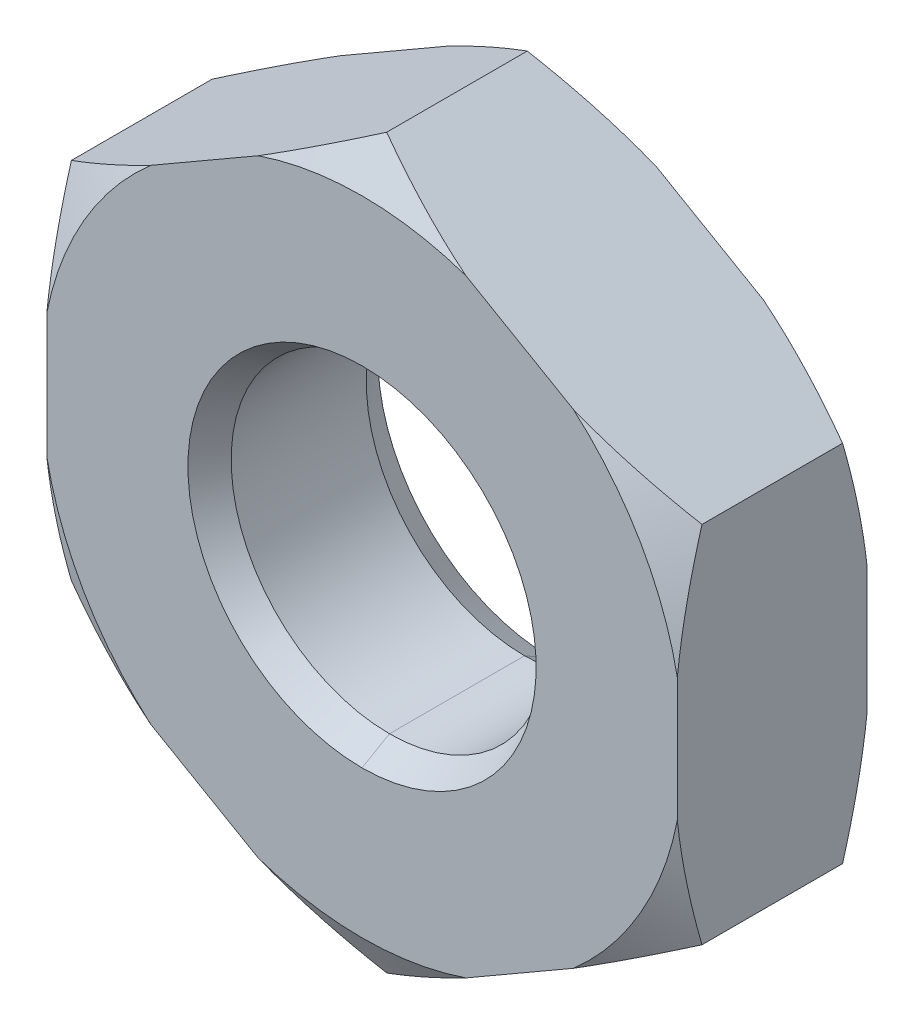
ISO-10303-21;
HEADER;
FILE_DESCRIPTION(('STEP AP214'),'2;1');
FILE_NAME('part.step','',(''),(''),'','','');
FILE_SCHEMA(('AUTOMOTIVE_DESIGN { 1 0 10303 214 1 1 1 1 }'));
ENDSEC;
DATA;
#1=APPLICATION_CONTEXT('core data for automotive mechanical design processes');
#2=APPLICATION_PROTOCOL_DEFINITION('international standard','automotive_design',2000,#1);
#3=PRODUCT_CONTEXT('',#1,'mechanical');
#4=PRODUCT('Part','Part','',(#3));
#5=PRODUCT_RELATED_PRODUCT_CATEGORY('part','',(#4));
#6=PRODUCT_DEFINITION_FORMATION('','',#4);
#7=PRODUCT_DEFINITION_CONTEXT('part definition',#1,'design');
#8=PRODUCT_DEFINITION('design','',#6,#7);
#9=PRODUCT_DEFINITION_SHAPE('','',#8);
#10=(LENGTH_UNIT() NAMED_UNIT(*) SI_UNIT(.MILLI.,.METRE.));
#11=(NAMED_UNIT(*) PLANE_ANGLE_UNIT() SI_UNIT($,.RADIAN.));
#12=(NAMED_UNIT(*) SI_UNIT($,.STERADIAN.) SOLID_ANGLE_UNIT());
#13=UNCERTAINTY_MEASURE_WITH_UNIT(LENGTH_MEASURE(1.E-05),#10,'distance_accuracy_value','');
#14=(GEOMETRIC_REPRESENTATION_CONTEXT(3) GLOBAL_UNCERTAINTY_ASSIGNED_CONTEXT((#13)) GLOBAL_UNIT_ASSIGNED_CONTEXT((#10,
#11,#12)) REPRESENTATION_CONTEXT('',''));
#15=CARTESIAN_POINT('',(0.,0.,0.));
#16=DIRECTION('',(0.,0.,1.));
#17=DIRECTION('',(1.,0.,0.));
#18=AXIS2_PLACEMENT_3D('',#15,#16,#17);
#19=CARTESIAN_POINT('',(0.,0.,-0.6));
#20=DIRECTION('',(0.,0.,1.));
#21=DIRECTION('',(0.479425538604204,-0.877582561890372,0.));
#22=AXIS2_PLACEMENT_3D('',#19,#20,#21);
#23=CONICAL_SURFACE('',#22,2.03001594543,1.0471975512);
#24=CARTESIAN_POINT('',(0.,0.,-0.6));
#25=DIRECTION('',(0.,0.,1.));
#26=DIRECTION('',(1.,0.,0.));
#27=AXIS2_PLACEMENT_3D('',#24,#25,#26);
#28=CIRCLE('',#27,2.03001594543);
#29=CARTESIAN_POINT('',(1.9918584287,0.391745757754,-0.6));
#30=VERTEX_POINT('',#29);
#31=CARTESIAN_POINT('',(1.33519099239,1.52912712112,-0.6));
#32=VERTEX_POINT('',#31);
#33=EDGE_CURVE('E322',#30,#32,#28,.T.);
#34=ORIENTED_EDGE('',*,*,#33,.T.);
#35=CARTESIAN_POINT('',(1.33519099239,1.52912712112,-0.6));
#36=CARTESIAN_POINT('',(1.46523461842,1.45404639863,-0.583269740997));
#37=CARTESIAN_POINT('',(1.59590801461,1.37860207816,-0.558740826829));
#38=CARTESIAN_POINT('',(1.72727925571,1.30275485675,-0.526817697776));
#39=CARTESIAN_POINT('',(1.85946427917,1.22643779787,-0.488256016597));
#40=CARTESIAN_POINT('',(1.9918584287,1.15,-0.44412463342));
#41=(BOUNDED_CURVE() B_SPLINE_CURVE(5,(#35,#36,#37,#38,#39,#40),.UNSPECIFIED.,.F.,
.F.) B_SPLINE_CURVE_WITH_KNOTS((6,6),(0.,1.10272272352),
.UNSPECIFIED.) CURVE() GEOMETRIC_REPRESENTATION_ITEM() RATIONAL_B_SPLINE_CURVE((1.,1.,1.,1.,1.,1.)) REPRESENTATION_ITEM(''));
#42=CARTESIAN_POINT('',(1.9918584287,1.15,-0.44412463342));
#43=VERTEX_POINT('',#42);
#44=EDGE_CURVE('E252',#32,#43,#41,.T.);
#45=ORIENTED_EDGE('',*,*,#44,.T.);
#46=CARTESIAN_POINT('',(1.9918584287,0.391745757754,-0.6));
#47=CARTESIAN_POINT('',(1.9918584287,0.541907202742,-0.583269740997));
#48=CARTESIAN_POINT('',(1.9918584287,0.692795843675,-0.558740826829));
#49=CARTESIAN_POINT('',(1.9918584287,0.8444902865,-0.526817697775));
#50=CARTESIAN_POINT('',(1.9918584287,0.997124404259,-0.488256016596));
#51=CARTESIAN_POINT('',(1.9918584287,1.15,-0.44412463342));
#52=(BOUNDED_CURVE() B_SPLINE_CURVE(5,(#46,#47,#48,#49,#50,#51),.UNSPECIFIED.,.F.,
.F.) B_SPLINE_CURVE_WITH_KNOTS((6,6),(0.,1.1027227235),
.UNSPECIFIED.) CURVE() GEOMETRIC_REPRESENTATION_ITEM() RATIONAL_B_SPLINE_CURVE((1.,1.,1.,1.,1.,1.)) REPRESENTATION_ITEM(''));
#53=EDGE_CURVE('E211',#30,#43,#52,.T.);
#54=ORIENTED_EDGE('',*,*,#53,.F.);
#55=EDGE_LOOP('',(#34,#45,#54));
#56=FACE_BOUND('',#55,.T.);
#57=ADVANCED_FACE('F17',(#56),#23,.T.);
#58=CARTESIAN_POINT('',(0.,0.,0.6));
#59=DIRECTION('',(0.,0.,-1.));
#60=DIRECTION('',(0.479425538604204,-0.877582561890372,0.));
#61=AXIS2_PLACEMENT_3D('',#58,#59,#60);
#62=CONICAL_SURFACE('',#61,2.03001594543,1.0471975512);
#63=CARTESIAN_POINT('',(1.33519099239,1.52912712112,0.6));
#64=CARTESIAN_POINT('',(1.46523461842,1.45404639863,0.583269740997));
#65=CARTESIAN_POINT('',(1.59590801461,1.37860207816,0.558740826829));
#66=CARTESIAN_POINT('',(1.72727925571,1.30275485675,0.526817697775));
#67=CARTESIAN_POINT('',(1.85946427917,1.22643779787,0.488256016597));
#68=CARTESIAN_POINT('',(1.9918584287,1.15,0.44412463342));
#69=(BOUNDED_CURVE() B_SPLINE_CURVE(5,(#63,#64,#65,#66,#67,#68),.UNSPECIFIED.,.F.,
.F.) B_SPLINE_CURVE_WITH_KNOTS((6,6),(0.,1.10272272351),
.UNSPECIFIED.) CURVE() GEOMETRIC_REPRESENTATION_ITEM() RATIONAL_B_SPLINE_CURVE((1.,1.,1.,1.,1.,1.)) REPRESENTATION_ITEM(''));
#70=CARTESIAN_POINT('',(1.33519099239,1.52912712112,0.6));
#71=VERTEX_POINT('',#70);
#72=CARTESIAN_POINT('',(1.9918584287,1.15,0.44412463342));
#73=VERTEX_POINT('',#72);
#74=EDGE_CURVE('E199',#71,#73,#69,.T.);
#75=ORIENTED_EDGE('',*,*,#74,.F.);
#76=CARTESIAN_POINT('',(0.,0.,0.6));
#77=DIRECTION('',(0.,0.,1.));
#78=DIRECTION('',(1.,0.,0.));
#79=AXIS2_PLACEMENT_3D('',#76,#77,#78);
#80=CIRCLE('',#79,2.03001594543);
#81=CARTESIAN_POINT('',(1.9918584287,0.391745757754,0.6));
#82=VERTEX_POINT('',#81);
#83=EDGE_CURVE('E171',#82,#71,#80,.T.);
#84=ORIENTED_EDGE('',*,*,#83,.F.);
#85=CARTESIAN_POINT('',(1.9918584287,0.391745757754,0.6));
#86=CARTESIAN_POINT('',(1.9918584287,0.541907202743,0.583269740997));
#87=CARTESIAN_POINT('',(1.9918584287,0.692795843676,0.558740826829));
#88=CARTESIAN_POINT('',(1.9918584287,0.844490286499,0.526817697775));
#89=CARTESIAN_POINT('',(1.9918584287,0.997124404259,0.488256016597));
#90=CARTESIAN_POINT('',(1.9918584287,1.15,0.44412463342));
#91=(BOUNDED_CURVE() B_SPLINE_CURVE(5,(#85,#86,#87,#88,#89,#90),.UNSPECIFIED.,.F.,
.F.) B_SPLINE_CURVE_WITH_KNOTS((6,6),(0.,1.10272272351),
.UNSPECIFIED.) CURVE() GEOMETRIC_REPRESENTATION_ITEM() RATIONAL_B_SPLINE_CURVE((1.,1.,1.,1.,1.,1.)) REPRESENTATION_ITEM(''));
#92=EDGE_CURVE('E160',#82,#73,#91,.T.);
#93=ORIENTED_EDGE('',*,*,#92,.T.);
#94=EDGE_LOOP('',(#75,#84,#93));
#95=FACE_BOUND('',#94,.T.);
#96=ADVANCED_FACE('F643',(#95),#62,.T.);
#97=CARTESIAN_POINT('',(0.,0.,0.6));
#98=DIRECTION('',(0.,0.,-1.));
#99=DIRECTION('',(0.479425538604204,-0.877582561890372,0.));
#100=AXIS2_PLACEMENT_3D('',#97,#98,#99);
#101=CONICAL_SURFACE('',#100,2.03001594543,1.0471975512);
#102=CARTESIAN_POINT('',(1.9918584287,-0.391745757754,0.6));
#103=CARTESIAN_POINT('',(1.9918584287,-0.541907202742,0.583269740997));
#104=CARTESIAN_POINT('',(1.9918584287,-0.692795843675,0.558740826829));
#105=CARTESIAN_POINT('',(1.9918584287,-0.8444902865,0.526817697775));
#106=CARTESIAN_POINT('',(1.9918584287,-0.997124404259,0.488256016596));
#107=CARTESIAN_POINT('',(1.9918584287,-1.15,0.44412463342));
#108=(BOUNDED_CURVE() B_SPLINE_CURVE(5,(#102,#103,#104,#105,#106,#107),.UNSPECIFIED.,.F.,
.F.) B_SPLINE_CURVE_WITH_KNOTS((6,6),(0.,1.1027227235),
.UNSPECIFIED.) CURVE() GEOMETRIC_REPRESENTATION_ITEM() RATIONAL_B_SPLINE_CURVE((1.,1.,1.,1.,1.,1.)) REPRESENTATION_ITEM(''));
#109=CARTESIAN_POINT('',(1.9918584287,-0.391745757754,0.6));
#110=VERTEX_POINT('',#109);
#111=CARTESIAN_POINT('',(1.9918584287,-1.15,0.44412463342));
#112=VERTEX_POINT('',#111);
#113=EDGE_CURVE('E148',#110,#112,#108,.T.);
#114=ORIENTED_EDGE('',*,*,#113,.F.);
#115=CARTESIAN_POINT('',(0.,0.,0.6));
#116=DIRECTION('',(0.,0.,1.));
#117=DIRECTION('',(1.,0.,0.));
#118=AXIS2_PLACEMENT_3D('',#115,#116,#117);
#119=CIRCLE('',#118,2.03001594543);
#120=CARTESIAN_POINT('',(1.33519099239,-1.52912712112,0.6));
#121=VERTEX_POINT('',#120);
#122=EDGE_CURVE('E152',#121,#110,#119,.T.);
#123=ORIENTED_EDGE('',*,*,#122,.F.);
#124=CARTESIAN_POINT('',(1.33519099239,-1.52912712112,0.6));
#125=CARTESIAN_POINT('',(1.46523461842,-1.45404639863,0.583269740997));
#126=CARTESIAN_POINT('',(1.59590801461,-1.37860207816,0.558740826829));
#127=CARTESIAN_POINT('',(1.72727925571,-1.30275485675,0.526817697775));
#128=CARTESIAN_POINT('',(1.85946427917,-1.22643779787,0.488256016597));
#129=CARTESIAN_POINT('',(1.9918584287,-1.15,0.44412463342));
#130=(BOUNDED_CURVE() B_SPLINE_CURVE(5,(#124,#125,#126,#127,#128,#129),.UNSPECIFIED.,.F.,
.F.) B_SPLINE_CURVE_WITH_KNOTS((6,6),(0.,1.10272272351),
.UNSPECIFIED.) CURVE() GEOMETRIC_REPRESENTATION_ITEM() RATIONAL_B_SPLINE_CURVE((1.,1.,1.,1.,1.,1.)) REPRESENTATION_ITEM(''));
#131=EDGE_CURVE('E154',#121,#112,#130,.T.);
#132=ORIENTED_EDGE('',*,*,#131,.T.);
#133=EDGE_LOOP('',(#114,#123,#132));
#134=FACE_BOUND('',#133,.T.);
#135=ADVANCED_FACE('F150',(#134),#101,.T.);
#136=CARTESIAN_POINT('',(0.,0.,-0.6));
#137=DIRECTION('',(0.,0.,1.));
#138=DIRECTION('',(0.479425538604204,-0.877582561890372,0.));
#139=AXIS2_PLACEMENT_3D('',#136,#137,#138);
#140=CONICAL_SURFACE('',#139,2.03001594543,1.0471975512);
#141=CARTESIAN_POINT('',(-0.656667436312,-1.92087287888,-0.6));
#142=CARTESIAN_POINT('',(-0.526623810279,-1.99595360137,-0.583269740997));
#143=CARTESIAN_POINT('',(-0.395950414085,-2.07139792184,-0.558740826828));
#144=CARTESIAN_POINT('',(-0.264579173003,-2.14724514325,-0.526817697777));
#145=CARTESIAN_POINT('',(-0.132394149534,-2.22356220213,-0.488256016598));
#146=CARTESIAN_POINT('',(0.,-2.3,-0.44412463342));
#147=(BOUNDED_CURVE() B_SPLINE_CURVE(5,(#141,#142,#143,#144,#145,#146),.UNSPECIFIED.,.F.,
.F.) B_SPLINE_CURVE_WITH_KNOTS((6,6),(0.,1.10272272354),
.UNSPECIFIED.) CURVE() GEOMETRIC_REPRESENTATION_ITEM() RATIONAL_B_SPLINE_CURVE((1.,1.,1.,1.,1.,1.)) REPRESENTATION_ITEM(''));
#148=CARTESIAN_POINT('',(-0.656667436312,-1.92087287888,-0.6));
#149=VERTEX_POINT('',#148);
#150=CARTESIAN_POINT('',(0.,-2.3,-0.44412463342));
#151=VERTEX_POINT('',#150);
#152=EDGE_CURVE('E407',#149,#151,#147,.T.);
#153=ORIENTED_EDGE('',*,*,#152,.F.);
#154=CARTESIAN_POINT('',(0.,0.,-0.6));
#155=DIRECTION('',(0.,0.,1.));
#156=DIRECTION('',(1.,0.,0.));
#157=AXIS2_PLACEMENT_3D('',#154,#155,#156);
#158=CIRCLE('',#157,2.03001594543);
#159=CARTESIAN_POINT('',(0.656667436312,-1.92087287888,-0.6));
#160=VERTEX_POINT('',#159);
#161=EDGE_CURVE('E370',#149,#160,#158,.T.);
#162=ORIENTED_EDGE('',*,*,#161,.T.);
#163=CARTESIAN_POINT('',(0.656667436312,-1.92087287888,-0.6));
#164=CARTESIAN_POINT('',(0.526623810281,-1.99595360137,-0.583269740997));
#165=CARTESIAN_POINT('',(0.395950414088,-2.07139792184,-0.558740826828));
#166=CARTESIAN_POINT('',(0.264579172999,-2.14724514325,-0.526817697776));
#167=CARTESIAN_POINT('',(0.132394149533,-2.22356220213,-0.488256016597));
#168=CARTESIAN_POINT('',(0.,-2.3,-0.44412463342));
#169=(BOUNDED_CURVE() B_SPLINE_CURVE(5,(#163,#164,#165,#166,#167,#168),.UNSPECIFIED.,.F.,
.F.) B_SPLINE_CURVE_WITH_KNOTS((6,6),(0.,1.10272272353),
.UNSPECIFIED.) CURVE() GEOMETRIC_REPRESENTATION_ITEM() RATIONAL_B_SPLINE_CURVE((1.,1.,1.,1.,1.,1.)) REPRESENTATION_ITEM(''));
#170=EDGE_CURVE('E251',#160,#151,#169,.T.);
#171=ORIENTED_EDGE('',*,*,#170,.T.);
#172=EDGE_LOOP('',(#153,#162,#171));
#173=FACE_BOUND('',#172,.T.);
#174=ADVANCED_FACE('F545',(#173),#140,.T.);
#175=CARTESIAN_POINT('',(0.,0.,0.6));
#176=DIRECTION('',(0.,0.,-1.));
#177=DIRECTION('',(0.479425538604204,-0.877582561890372,0.));
#178=AXIS2_PLACEMENT_3D('',#175,#176,#177);
#179=CONICAL_SURFACE('',#178,2.03001594543,1.0471975512);
#180=CARTESIAN_POINT('',(0.656667436312,-1.92087287888,0.6));
#181=CARTESIAN_POINT('',(0.526623810283,-1.99595360137,0.583269740997));
#182=CARTESIAN_POINT('',(0.395950414091,-2.07139792184,0.558740826829));
#183=CARTESIAN_POINT('',(0.264579172996,-2.14724514325,0.526817697775));
#184=CARTESIAN_POINT('',(0.132394149531,-2.22356220213,0.488256016597));
#185=CARTESIAN_POINT('',(0.,-2.3,0.44412463342));
#186=(BOUNDED_CURVE() B_SPLINE_CURVE(5,(#180,#181,#182,#183,#184,#185),.UNSPECIFIED.,.F.,
.F.) B_SPLINE_CURVE_WITH_KNOTS((6,6),(0.,1.10272272351),
.UNSPECIFIED.) CURVE() GEOMETRIC_REPRESENTATION_ITEM() RATIONAL_B_SPLINE_CURVE((1.,1.,1.,1.,1.,1.)) REPRESENTATION_ITEM(''));
#187=CARTESIAN_POINT('',(0.656667436312,-1.92087287888,0.6));
#188=VERTEX_POINT('',#187);
#189=CARTESIAN_POINT('',(0.,-2.3,0.44412463342));
#190=VERTEX_POINT('',#189);
#191=EDGE_CURVE('E231',#188,#190,#186,.T.);
#192=ORIENTED_EDGE('',*,*,#191,.F.);
#193=CARTESIAN_POINT('',(0.,0.,0.6));
#194=DIRECTION('',(0.,0.,1.));
#195=DIRECTION('',(1.,0.,0.));
#196=AXIS2_PLACEMENT_3D('',#193,#194,#195);
#197=CIRCLE('',#196,2.03001594543);
#198=CARTESIAN_POINT('',(-0.656667436312,-1.92087287888,0.6));
#199=VERTEX_POINT('',#198);
#200=EDGE_CURVE('E184',#199,#188,#197,.T.);
#201=ORIENTED_EDGE('',*,*,#200,.F.);
#202=CARTESIAN_POINT('',(-0.656667436312,-1.92087287888,0.6));
#203=CARTESIAN_POINT('',(-0.526623810284,-1.99595360137,0.583269740997));
#204=CARTESIAN_POINT('',(-0.395950414093,-2.07139792184,0.558740826829));
#205=CARTESIAN_POINT('',(-0.264579172994,-2.14724514325,0.526817697775));
#206=CARTESIAN_POINT('',(-0.13239414953,-2.22356220213,0.488256016596));
#207=CARTESIAN_POINT('',(0.,-2.3,0.44412463342));
#208=(BOUNDED_CURVE() B_SPLINE_CURVE(5,(#202,#203,#204,#205,#206,#207),.UNSPECIFIED.,.F.,
.F.) B_SPLINE_CURVE_WITH_KNOTS((6,6),(0.,1.1027227235),
.UNSPECIFIED.) CURVE() GEOMETRIC_REPRESENTATION_ITEM() RATIONAL_B_SPLINE_CURVE((1.,1.,1.,1.,1.,1.)) REPRESENTATION_ITEM(''));
#209=EDGE_CURVE('E415',#199,#190,#208,.T.);
#210=ORIENTED_EDGE('',*,*,#209,.T.);
#211=EDGE_LOOP('',(#192,#201,#210));
#212=FACE_BOUND('',#211,.T.);
#213=ADVANCED_FACE('F674',(#212),#179,.T.);
#214=CARTESIAN_POINT('',(0.,0.,-0.6));
#215=DIRECTION('',(0.,0.,1.));
#216=DIRECTION('',(0.479425538604204,-0.877582561890372,0.));
#217=AXIS2_PLACEMENT_3D('',#214,#215,#216);
#218=CONICAL_SURFACE('',#217,2.03001594543,1.0471975512);
#219=CARTESIAN_POINT('',(0.656667436312,1.92087287888,-0.6));
#220=CARTESIAN_POINT('',(0.526623810284,1.99595360137,-0.583269740997));
#221=CARTESIAN_POINT('',(0.395950414094,2.07139792184,-0.558740826829));
#222=CARTESIAN_POINT('',(0.264579172993,2.14724514325,-0.526817697774));
#223=CARTESIAN_POINT('',(0.13239414953,2.22356220213,-0.488256016596));
#224=CARTESIAN_POINT('',(0.,2.3,-0.44412463342));
#225=(BOUNDED_CURVE() B_SPLINE_CURVE(5,(#219,#220,#221,#222,#223,#224),.UNSPECIFIED.,.F.,
.F.) B_SPLINE_CURVE_WITH_KNOTS((6,6),(0.,1.1027227235),
.UNSPECIFIED.) CURVE() GEOMETRIC_REPRESENTATION_ITEM() RATIONAL_B_SPLINE_CURVE((1.,1.,1.,1.,1.,1.)) REPRESENTATION_ITEM(''));
#226=CARTESIAN_POINT('',(0.656667436312,1.92087287888,-0.6));
#227=VERTEX_POINT('',#226);
#228=CARTESIAN_POINT('',(0.,2.3,-0.44412463342));
#229=VERTEX_POINT('',#228);
#230=EDGE_CURVE('E257',#227,#229,#225,.T.);
#231=ORIENTED_EDGE('',*,*,#230,.F.);
#232=CARTESIAN_POINT('',(0.,0.,-0.6));
#233=DIRECTION('',(0.,0.,1.));
#234=DIRECTION('',(1.,0.,0.));
#235=AXIS2_PLACEMENT_3D('',#232,#233,#234);
#236=CIRCLE('',#235,2.03001594543);
#237=CARTESIAN_POINT('',(-0.656667436312,1.92087287888,-0.6));
#238=VERTEX_POINT('',#237);
#239=EDGE_CURVE('E344',#227,#238,#236,.T.);
#240=ORIENTED_EDGE('',*,*,#239,.T.);
#241=CARTESIAN_POINT('',(-0.656667436312,1.92087287888,-0.6));
#242=CARTESIAN_POINT('',(-0.526623810282,1.99595360137,-0.583269740997));
#243=CARTESIAN_POINT('',(-0.39595041409,2.07139792184,-0.558740826829));
#244=CARTESIAN_POINT('',(-0.264579172997,2.14724514325,-0.526817697775));
#245=CARTESIAN_POINT('',(-0.132394149532,2.22356220213,-0.488256016597));
#246=CARTESIAN_POINT('',(0.,2.3,-0.44412463342));
#247=(BOUNDED_CURVE() B_SPLINE_CURVE(5,(#241,#242,#243,#244,#245,#246),.UNSPECIFIED.,.F.,
.F.) B_SPLINE_CURVE_WITH_KNOTS((6,6),(0.,1.10272272352),
.UNSPECIFIED.) CURVE() GEOMETRIC_REPRESENTATION_ITEM() RATIONAL_B_SPLINE_CURVE((1.,1.,1.,1.,1.,1.)) REPRESENTATION_ITEM(''));
#248=EDGE_CURVE('E212',#238,#229,#247,.T.);
#249=ORIENTED_EDGE('',*,*,#248,.T.);
#250=EDGE_LOOP('',(#231,#240,#249));
#251=FACE_BOUND('',#250,.T.);
#252=ADVANCED_FACE('F662',(#251),#218,.T.);
#253=CARTESIAN_POINT('',(0.,0.,0.6));
#254=DIRECTION('',(0.,0.,-1.));
#255=DIRECTION('',(0.479425538604204,-0.877582561890372,0.));
#256=AXIS2_PLACEMENT_3D('',#253,#254,#255);
#257=CONICAL_SURFACE('',#256,2.03001594543,1.0471975512);
#258=CARTESIAN_POINT('',(-1.33519099239,-1.52912712112,0.6));
#259=CARTESIAN_POINT('',(-1.46523461842,-1.45404639863,0.583269740997));
#260=CARTESIAN_POINT('',(-1.59590801461,-1.37860207816,0.558740826829));
#261=CARTESIAN_POINT('',(-1.72727925571,-1.30275485675,0.526817697775));
#262=CARTESIAN_POINT('',(-1.85946427917,-1.22643779787,0.488256016597));
#263=CARTESIAN_POINT('',(-1.9918584287,-1.15,0.44412463342));
#264=(BOUNDED_CURVE() B_SPLINE_CURVE(5,(#258,#259,#260,#261,#262,#263),.UNSPECIFIED.,.F.,
.F.) B_SPLINE_CURVE_WITH_KNOTS((6,6),(0.,1.10272272351),
.UNSPECIFIED.) CURVE() GEOMETRIC_REPRESENTATION_ITEM() RATIONAL_B_SPLINE_CURVE((1.,1.,1.,1.,1.,1.)) REPRESENTATION_ITEM(''));
#265=CARTESIAN_POINT('',(-1.33519099239,-1.52912712112,0.6));
#266=VERTEX_POINT('',#265);
#267=CARTESIAN_POINT('',(-1.9918584287,-1.15,0.44412463342));
#268=VERTEX_POINT('',#267);
#269=EDGE_CURVE('E332',#266,#268,#264,.T.);
#270=ORIENTED_EDGE('',*,*,#269,.F.);
#271=CARTESIAN_POINT('',(0.,0.,0.6));
#272=DIRECTION('',(0.,0.,1.));
#273=DIRECTION('',(1.,0.,0.));
#274=AXIS2_PLACEMENT_3D('',#271,#272,#273);
#275=CIRCLE('',#274,2.03001594543);
#276=CARTESIAN_POINT('',(-1.9918584287,-0.391745757754,0.6));
#277=VERTEX_POINT('',#276);
#278=EDGE_CURVE('E232',#277,#266,#275,.T.);
#279=ORIENTED_EDGE('',*,*,#278,.F.);
#280=CARTESIAN_POINT('',(-1.9918584287,-0.391745757754,0.6));
#281=CARTESIAN_POINT('',(-1.9918584287,-0.541907202743,0.583269740997));
#282=CARTESIAN_POINT('',(-1.9918584287,-0.692795843676,0.558740826829));
#283=CARTESIAN_POINT('',(-1.9918584287,-0.844490286499,0.526817697775));
#284=CARTESIAN_POINT('',(-1.9918584287,-0.997124404259,0.488256016597));
#285=CARTESIAN_POINT('',(-1.9918584287,-1.15,0.44412463342));
#286=(BOUNDED_CURVE() B_SPLINE_CURVE(5,(#280,#281,#282,#283,#284,#285),.UNSPECIFIED.,.F.,
.F.) B_SPLINE_CURVE_WITH_KNOTS((6,6),(0.,1.10272272351),
.UNSPECIFIED.) CURVE() GEOMETRIC_REPRESENTATION_ITEM() RATIONAL_B_SPLINE_CURVE((1.,1.,1.,1.,1.,1.)) REPRESENTATION_ITEM(''));
#287=EDGE_CURVE('E363',#277,#268,#286,.T.);
#288=ORIENTED_EDGE('',*,*,#287,.T.);
#289=EDGE_LOOP('',(#270,#279,#288));
#290=FACE_BOUND('',#289,.T.);
#291=ADVANCED_FACE('F626',(#290),#257,.T.);
#292=CARTESIAN_POINT('',(0.,0.,-0.6));
#293=DIRECTION('',(0.,0.,1.));
#294=DIRECTION('',(0.479425538604204,-0.877582561890372,0.));
#295=AXIS2_PLACEMENT_3D('',#292,#293,#294);
#296=CONICAL_SURFACE('',#295,2.03001594543,1.0471975512);
#297=CARTESIAN_POINT('',(0.,0.,-0.6));
#298=DIRECTION('',(0.,0.,1.));
#299=DIRECTION('',(1.,0.,0.));
#300=AXIS2_PLACEMENT_3D('',#297,#298,#299);
#301=CIRCLE('',#300,2.03001594543);
#302=CARTESIAN_POINT('',(-1.33519099239,1.52912712112,-0.6));
#303=VERTEX_POINT('',#302);
#304=CARTESIAN_POINT('',(-1.9918584287,0.391745757754,-0.6));
#305=VERTEX_POINT('',#304);
#306=EDGE_CURVE('E188',#303,#305,#301,.T.);
#307=ORIENTED_EDGE('',*,*,#306,.T.);
#308=CARTESIAN_POINT('',(-1.9918584287,0.391745757754,-0.6));
#309=CARTESIAN_POINT('',(-1.9918584287,0.541907202744,-0.583269740997));
#310=CARTESIAN_POINT('',(-1.9918584287,0.692795843678,-0.558740826829));
#311=CARTESIAN_POINT('',(-1.9918584287,0.844490286497,-0.526817697775));
#312=CARTESIAN_POINT('',(-1.9918584287,0.997124404258,-0.488256016597));
#313=CARTESIAN_POINT('',(-1.9918584287,1.15,-0.44412463342));
#314=(BOUNDED_CURVE() B_SPLINE_CURVE(5,(#308,#309,#310,#311,#312,#313),.UNSPECIFIED.,.F.,
.F.) B_SPLINE_CURVE_WITH_KNOTS((6,6),(0.,1.10272272352),
.UNSPECIFIED.) CURVE() GEOMETRIC_REPRESENTATION_ITEM() RATIONAL_B_SPLINE_CURVE((1.,1.,1.,1.,1.,1.)) REPRESENTATION_ITEM(''));
#315=CARTESIAN_POINT('',(-1.9918584287,1.15,-0.44412463342));
#316=VERTEX_POINT('',#315);
#317=EDGE_CURVE('E331',#305,#316,#314,.T.);
#318=ORIENTED_EDGE('',*,*,#317,.T.);
#319=CARTESIAN_POINT('',(-1.33519099239,1.52912712112,-0.6));
#320=CARTESIAN_POINT('',(-1.46523461842,1.45404639863,-0.583269740997));
#321=CARTESIAN_POINT('',(-1.59590801461,1.37860207816,-0.558740826829));
#322=CARTESIAN_POINT('',(-1.72727925571,1.30275485675,-0.526817697775));
#323=CARTESIAN_POINT('',(-1.85946427917,1.22643779787,-0.488256016597));
#324=CARTESIAN_POINT('',(-1.9918584287,1.15,-0.44412463342));
#325=(BOUNDED_CURVE() B_SPLINE_CURVE(5,(#319,#320,#321,#322,#323,#324),.UNSPECIFIED.,.F.,
.F.) B_SPLINE_CURVE_WITH_KNOTS((6,6),(0.,1.10272272351),
.UNSPECIFIED.) CURVE() GEOMETRIC_REPRESENTATION_ITEM() RATIONAL_B_SPLINE_CURVE((1.,1.,1.,1.,1.,1.)) REPRESENTATION_ITEM(''));
#326=EDGE_CURVE('E221',#303,#316,#325,.T.);
#327=ORIENTED_EDGE('',*,*,#326,.F.);
#328=EDGE_LOOP('',(#307,#318,#327));
#329=FACE_BOUND('',#328,.T.);
#330=ADVANCED_FACE('F631',(#329),#296,.T.);
#331=CARTESIAN_POINT('',(0.,0.,0.6));
#332=DIRECTION('',(0.,0.,-1.));
#333=DIRECTION('',(0.479425538604204,-0.877582561890372,0.));
#334=AXIS2_PLACEMENT_3D('',#331,#332,#333);
#335=CONICAL_SURFACE('',#334,2.03001594543,1.0471975512);
#336=CARTESIAN_POINT('',(-1.9918584287,0.391745757754,0.6));
#337=CARTESIAN_POINT('',(-1.9918584287,0.541907202744,0.583269740997));
#338=CARTESIAN_POINT('',(-1.9918584287,0.692795843678,0.558740826829));
#339=CARTESIAN_POINT('',(-1.9918584287,0.844490286497,0.526817697775));
#340=CARTESIAN_POINT('',(-1.9918584287,0.997124404258,0.488256016597));
#341=CARTESIAN_POINT('',(-1.9918584287,1.15,0.44412463342));
#342=(BOUNDED_CURVE() B_SPLINE_CURVE(5,(#336,#337,#338,#339,#340,#341),.UNSPECIFIED.,.F.,
.F.) B_SPLINE_CURVE_WITH_KNOTS((6,6),(0.,1.10272272351),
.UNSPECIFIED.) CURVE() GEOMETRIC_REPRESENTATION_ITEM() RATIONAL_B_SPLINE_CURVE((1.,1.,1.,1.,1.,1.)) REPRESENTATION_ITEM(''));
#343=CARTESIAN_POINT('',(-1.9918584287,0.391745757754,0.6));
#344=VERTEX_POINT('',#343);
#345=CARTESIAN_POINT('',(-1.9918584287,1.15,0.44412463342));
#346=VERTEX_POINT('',#345);
#347=EDGE_CURVE('E368',#344,#346,#342,.T.);
#348=ORIENTED_EDGE('',*,*,#347,.F.);
#349=CARTESIAN_POINT('',(0.,0.,0.6));
#350=DIRECTION('',(0.,0.,1.));
#351=DIRECTION('',(1.,0.,0.));
#352=AXIS2_PLACEMENT_3D('',#349,#350,#351);
#353=CIRCLE('',#352,2.03001594543);
#354=CARTESIAN_POINT('',(-1.33519099239,1.52912712112,0.6));
#355=VERTEX_POINT('',#354);
#356=EDGE_CURVE('E321',#355,#344,#353,.T.);
#357=ORIENTED_EDGE('',*,*,#356,.F.);
#358=CARTESIAN_POINT('',(-1.33519099239,1.52912712112,0.6));
#359=CARTESIAN_POINT('',(-1.46523461842,1.45404639863,0.583269740997));
#360=CARTESIAN_POINT('',(-1.59590801461,1.37860207816,0.558740826829));
#361=CARTESIAN_POINT('',(-1.72727925571,1.30275485675,0.526817697776));
#362=CARTESIAN_POINT('',(-1.85946427917,1.22643779787,0.488256016597));
#363=CARTESIAN_POINT('',(-1.9918584287,1.15,0.44412463342));
#364=(BOUNDED_CURVE() B_SPLINE_CURVE(5,(#358,#359,#360,#361,#362,#363),.UNSPECIFIED.,.F.,
.F.) B_SPLINE_CURVE_WITH_KNOTS((6,6),(0.,1.10272272352),
.UNSPECIFIED.) CURVE() GEOMETRIC_REPRESENTATION_ITEM() RATIONAL_B_SPLINE_CURVE((1.,1.,1.,1.,1.,1.)) REPRESENTATION_ITEM(''));
#365=EDGE_CURVE('E28',#355,#346,#364,.T.);
#366=ORIENTED_EDGE('',*,*,#365,.T.);
#367=EDGE_LOOP('',(#348,#357,#366));
#368=FACE_BOUND('',#367,.T.);
#369=ADVANCED_FACE('F628',(#368),#335,.T.);
#370=CARTESIAN_POINT('',(0.,0.,0.6));
#371=DIRECTION('',(0.,0.,-1.));
#372=DIRECTION('',(0.479425538604204,-0.877582561890372,0.));
#373=AXIS2_PLACEMENT_3D('',#370,#371,#372);
#374=CONICAL_SURFACE('',#373,2.03001594543,1.0471975512);
#375=CARTESIAN_POINT('',(0.656667436312,1.92087287888,0.6));
#376=CARTESIAN_POINT('',(0.526623810283,1.99595360137,0.583269740997));
#377=CARTESIAN_POINT('',(0.395950414092,2.07139792184,0.558740826829));
#378=CARTESIAN_POINT('',(0.264579172995,2.14724514325,0.526817697775));
#379=CARTESIAN_POINT('',(0.132394149531,2.22356220213,0.488256016597));
#380=CARTESIAN_POINT('',(0.,2.3,0.44412463342));
#381=(BOUNDED_CURVE() B_SPLINE_CURVE(5,(#375,#376,#377,#378,#379,#380),.UNSPECIFIED.,.F.,
.F.) B_SPLINE_CURVE_WITH_KNOTS((6,6),(0.,1.10272272351),
.UNSPECIFIED.) CURVE() GEOMETRIC_REPRESENTATION_ITEM() RATIONAL_B_SPLINE_CURVE((1.,1.,1.,1.,1.,1.)) REPRESENTATION_ITEM(''));
#382=CARTESIAN_POINT('',(0.656667436312,1.92087287888,0.6));
#383=VERTEX_POINT('',#382);
#384=CARTESIAN_POINT('',(0.,2.3,0.44412463342));
#385=VERTEX_POINT('',#384);
#386=EDGE_CURVE('E258',#383,#385,#381,.T.);
#387=ORIENTED_EDGE('',*,*,#386,.T.);
#388=CARTESIAN_POINT('',(-0.656667436312,1.92087287888,0.6));
#389=CARTESIAN_POINT('',(-0.526623810283,1.99595360137,0.583269740997));
#390=CARTESIAN_POINT('',(-0.395950414092,2.07139792184,0.558740826829));
#391=CARTESIAN_POINT('',(-0.264579172995,2.14724514325,0.526817697775));
#392=CARTESIAN_POINT('',(-0.132394149531,2.22356220213,0.488256016597));
#393=CARTESIAN_POINT('',(0.,2.3,0.44412463342));
#394=(BOUNDED_CURVE() B_SPLINE_CURVE(5,(#388,#389,#390,#391,#392,#393),.UNSPECIFIED.,.F.,
.F.) B_SPLINE_CURVE_WITH_KNOTS((6,6),(0.,1.10272272351),
.UNSPECIFIED.) CURVE() GEOMETRIC_REPRESENTATION_ITEM() RATIONAL_B_SPLINE_CURVE((1.,1.,1.,1.,1.,1.)) REPRESENTATION_ITEM(''));
#395=CARTESIAN_POINT('',(-0.656667436312,1.92087287888,0.6));
#396=VERTEX_POINT('',#395);
#397=EDGE_CURVE('E11',#396,#385,#394,.T.);
#398=ORIENTED_EDGE('',*,*,#397,.F.);
#399=CARTESIAN_POINT('',(0.,0.,0.6));
#400=DIRECTION('',(0.,0.,1.));
#401=DIRECTION('',(1.,0.,0.));
#402=AXIS2_PLACEMENT_3D('',#399,#400,#401);
#403=CIRCLE('',#402,2.03001594543);
#404=EDGE_CURVE('E190',#383,#396,#403,.T.);
#405=ORIENTED_EDGE('',*,*,#404,.F.);
#406=EDGE_LOOP('',(#387,#398,#405));
#407=FACE_BOUND('',#406,.T.);
#408=ADVANCED_FACE('F630',(#407),#374,.T.);
#409=CARTESIAN_POINT('',(0.,0.,-0.6));
#410=DIRECTION('',(0.,0.,1.));
#411=DIRECTION('',(0.479425538604204,-0.877582561890372,0.));
#412=AXIS2_PLACEMENT_3D('',#409,#410,#411);
#413=CONICAL_SURFACE('',#412,2.03001594543,1.0471975512);
#414=CARTESIAN_POINT('',(0.,0.,-0.6));
#415=DIRECTION('',(0.,0.,1.));
#416=DIRECTION('',(1.,0.,0.));
#417=AXIS2_PLACEMENT_3D('',#414,#415,#416);
#418=CIRCLE('',#417,2.03001594543);
#419=CARTESIAN_POINT('',(1.33519099239,-1.52912712112,-0.6));
#420=VERTEX_POINT('',#419);
#421=CARTESIAN_POINT('',(1.9918584287,-0.391745757754,-0.6));
#422=VERTEX_POINT('',#421);
#423=EDGE_CURVE('E355',#420,#422,#418,.T.);
#424=ORIENTED_EDGE('',*,*,#423,.T.);
#425=CARTESIAN_POINT('',(1.9918584287,-0.391745757754,-0.6));
#426=CARTESIAN_POINT('',(1.9918584287,-0.541907202744,-0.583269740997));
#427=CARTESIAN_POINT('',(1.9918584287,-0.692795843679,-0.558740826829));
#428=CARTESIAN_POINT('',(1.9918584287,-0.844490286496,-0.526817697776));
#429=CARTESIAN_POINT('',(1.9918584287,-0.997124404257,-0.488256016597));
#430=CARTESIAN_POINT('',(1.9918584287,-1.15,-0.44412463342));
#431=(BOUNDED_CURVE() B_SPLINE_CURVE(5,(#425,#426,#427,#428,#429,#430),.UNSPECIFIED.,.F.,
.F.) B_SPLINE_CURVE_WITH_KNOTS((6,6),(0.,1.10272272352),
.UNSPECIFIED.) CURVE() GEOMETRIC_REPRESENTATION_ITEM() RATIONAL_B_SPLINE_CURVE((1.,1.,1.,1.,1.,1.)) REPRESENTATION_ITEM(''));
#432=CARTESIAN_POINT('',(1.9918584287,-1.15,-0.44412463342));
#433=VERTEX_POINT('',#432);
#434=EDGE_CURVE('E198',#422,#433,#431,.T.);
#435=ORIENTED_EDGE('',*,*,#434,.T.);
#436=CARTESIAN_POINT('',(1.33519099239,-1.52912712112,-0.6));
#437=CARTESIAN_POINT('',(1.46523461842,-1.45404639863,-0.583269740997));
#438=CARTESIAN_POINT('',(1.59590801461,-1.37860207816,-0.558740826829));
#439=CARTESIAN_POINT('',(1.72727925571,-1.30275485675,-0.526817697775));
#440=CARTESIAN_POINT('',(1.85946427917,-1.22643779787,-0.488256016597));
#441=CARTESIAN_POINT('',(1.9918584287,-1.15,-0.44412463342));
#442=(BOUNDED_CURVE() B_SPLINE_CURVE(5,(#436,#437,#438,#439,#440,#441),.UNSPECIFIED.,.F.,
.F.) B_SPLINE_CURVE_WITH_KNOTS((6,6),(0.,1.10272272351),
.UNSPECIFIED.) CURVE() GEOMETRIC_REPRESENTATION_ITEM() RATIONAL_B_SPLINE_CURVE((1.,1.,1.,1.,1.,1.)) REPRESENTATION_ITEM(''));
#443=EDGE_CURVE('E291',#420,#433,#442,.T.);
#444=ORIENTED_EDGE('',*,*,#443,.F.);
#445=EDGE_LOOP('',(#424,#435,#444));
#446=FACE_BOUND('',#445,.T.);
#447=ADVANCED_FACE('F637',(#446),#413,.T.);
#448=CARTESIAN_POINT('',(0.,0.,-0.6));
#449=DIRECTION('',(0.,0.,1.));
#450=DIRECTION('',(0.479425538604204,-0.877582561890372,0.));
#451=AXIS2_PLACEMENT_3D('',#448,#449,#450);
#452=CONICAL_SURFACE('',#451,2.03001594543,1.0471975512);
#453=CARTESIAN_POINT('',(0.,0.,-0.6));
#454=DIRECTION('',(0.,0.,1.));
#455=DIRECTION('',(1.,0.,0.));
#456=AXIS2_PLACEMENT_3D('',#453,#454,#455);
#457=CIRCLE('',#456,2.03001594543);
#458=CARTESIAN_POINT('',(-1.9918584287,-0.391745757754,-0.6));
#459=VERTEX_POINT('',#458);
#460=CARTESIAN_POINT('',(-1.33519099239,-1.52912712112,-0.6));
#461=VERTEX_POINT('',#460);
#462=EDGE_CURVE('E401',#459,#461,#457,.T.);
#463=ORIENTED_EDGE('',*,*,#462,.T.);
#464=CARTESIAN_POINT('',(-1.33519099239,-1.52912712112,-0.6));
#465=CARTESIAN_POINT('',(-1.46523461843,-1.45404639863,-0.583269740997));
#466=CARTESIAN_POINT('',(-1.59590801462,-1.37860207816,-0.558740826827));
#467=CARTESIAN_POINT('',(-1.7272792557,-1.30275485676,-0.526817697778));
#468=CARTESIAN_POINT('',(-1.85946427917,-1.22643779787,-0.488256016598));
#469=CARTESIAN_POINT('',(-1.9918584287,-1.15,-0.44412463342));
#470=(BOUNDED_CURVE() B_SPLINE_CURVE(5,(#464,#465,#466,#467,#468,#469),.UNSPECIFIED.,.F.,
.F.) B_SPLINE_CURVE_WITH_KNOTS((6,6),(0.,1.10272272355),
.UNSPECIFIED.) CURVE() GEOMETRIC_REPRESENTATION_ITEM() RATIONAL_B_SPLINE_CURVE((1.,1.,1.,1.,1.,1.)) REPRESENTATION_ITEM(''));
#471=CARTESIAN_POINT('',(-1.9918584287,-1.15,-0.44412463342));
#472=VERTEX_POINT('',#471);
#473=EDGE_CURVE('E230',#461,#472,#470,.T.);
#474=ORIENTED_EDGE('',*,*,#473,.T.);
#475=CARTESIAN_POINT('',(-1.9918584287,-0.391745757754,-0.6));
#476=CARTESIAN_POINT('',(-1.9918584287,-0.541907202745,-0.583269740997));
#477=CARTESIAN_POINT('',(-1.9918584287,-0.692795843681,-0.558740826828));
#478=CARTESIAN_POINT('',(-1.9918584287,-0.844490286494,-0.526817697776));
#479=CARTESIAN_POINT('',(-1.9918584287,-0.997124404256,-0.488256016597));
#480=CARTESIAN_POINT('',(-1.9918584287,-1.15,-0.44412463342));
#481=(BOUNDED_CURVE() B_SPLINE_CURVE(5,(#475,#476,#477,#478,#479,#480),.UNSPECIFIED.,.F.,
.F.) B_SPLINE_CURVE_WITH_KNOTS((6,6),(0.,1.10272272352),
.UNSPECIFIED.) CURVE() GEOMETRIC_REPRESENTATION_ITEM() RATIONAL_B_SPLINE_CURVE((1.,1.,1.,1.,1.,1.)) REPRESENTATION_ITEM(''));
#482=EDGE_CURVE('E369',#459,#472,#481,.T.);
#483=ORIENTED_EDGE('',*,*,#482,.F.);
#484=EDGE_LOOP('',(#463,#474,#483));
#485=FACE_BOUND('',#484,.T.);
#486=ADVANCED_FACE('F659',(#485),#452,.T.);
#487=CARTESIAN_POINT('',(0.,2.3,0.));
#488=DIRECTION('',(-0.50000000000019,0.866025403784329,0.));
#489=DIRECTION('',(0.,0.,1.));
#490=AXIS2_PLACEMENT_3D('',#487,#488,#489);
#491=PLANE('',#490);
#492=ORIENTED_EDGE('',*,*,#248,.F.);
#493=DIRECTION('',(-0.866025403784329,-0.50000000000019,0.));
#494=VECTOR('',#493,1.);
#495=CARTESIAN_POINT('',(-0.995929214352,1.725,-0.6));
#496=LINE('',#495,#494);
#497=EDGE_CURVE('E349',#238,#303,#496,.T.);
#498=ORIENTED_EDGE('',*,*,#497,.T.);
#499=ORIENTED_EDGE('',*,*,#326,.T.);
#500=DIRECTION('',(0.,0.,1.));
#501=VECTOR('',#500,1.);
#502=CARTESIAN_POINT('',(-1.9918584287,1.15,0.));
#503=LINE('',#502,#501);
#504=EDGE_CURVE('E222',#316,#346,#503,.T.);
#505=ORIENTED_EDGE('',*,*,#504,.T.);
#506=ORIENTED_EDGE('',*,*,#365,.F.);
#507=DIRECTION('',(-0.866025403784329,-0.50000000000019,0.));
#508=VECTOR('',#507,1.);
#509=CARTESIAN_POINT('',(-0.995929214352,1.725,0.6));
#510=LINE('',#509,#508);
#511=EDGE_CURVE('E194',#396,#355,#510,.T.);
#512=ORIENTED_EDGE('',*,*,#511,.F.);
#513=ORIENTED_EDGE('',*,*,#397,.T.);
#514=DIRECTION('',(0.,0.,1.));
#515=VECTOR('',#514,1.);
#516=CARTESIAN_POINT('',(0.,2.3,0.));
#517=LINE('',#516,#515);
#518=EDGE_CURVE('E266',#229,#385,#517,.T.);
#519=ORIENTED_EDGE('',*,*,#518,.F.);
#520=EDGE_LOOP('',(#492,#498,#499,#505,#506,#512,#513,#519));
#521=FACE_BOUND('',#520,.T.);
#522=ADVANCED_FACE('F656',(#521),#491,.T.);
#523=CARTESIAN_POINT('',(-1.9918584287,1.15,0.));
#524=DIRECTION('',(-1.,0.,0.));
#525=DIRECTION('',(0.,1.,0.));
#526=AXIS2_PLACEMENT_3D('',#523,#524,#525);
#527=PLANE('',#526);
#528=ORIENTED_EDGE('',*,*,#317,.F.);
#529=DIRECTION('',(0.,-1.,0.));
#530=VECTOR('',#529,1.);
#531=CARTESIAN_POINT('',(-1.9918584287,0.,-0.6));
#532=LINE('',#531,#530);
#533=EDGE_CURVE('E404',#305,#459,#532,.T.);
#534=ORIENTED_EDGE('',*,*,#533,.T.);
#535=ORIENTED_EDGE('',*,*,#482,.T.);
#536=DIRECTION('',(0.,0.,1.));
#537=VECTOR('',#536,1.);
#538=CARTESIAN_POINT('',(-1.9918584287,-1.15,0.));
#539=LINE('',#538,#537);
#540=EDGE_CURVE('E327',#472,#268,#539,.T.);
#541=ORIENTED_EDGE('',*,*,#540,.T.);
#542=ORIENTED_EDGE('',*,*,#287,.F.);
#543=DIRECTION('',(0.,-1.,0.));
#544=VECTOR('',#543,1.);
#545=CARTESIAN_POINT('',(-1.9918584287,0.,0.6));
#546=LINE('',#545,#544);
#547=EDGE_CURVE('E236',#344,#277,#546,.T.);
#548=ORIENTED_EDGE('',*,*,#547,.F.);
#549=ORIENTED_EDGE('',*,*,#347,.T.);
#550=ORIENTED_EDGE('',*,*,#504,.F.);
#551=EDGE_LOOP('',(#528,#534,#535,#541,#542,#548,#549,#550));
#552=FACE_BOUND('',#551,.T.);
#553=ADVANCED_FACE('F19',(#552),#527,.T.);
#554=CARTESIAN_POINT('',(-1.9918584287,-1.15,0.));
#555=DIRECTION('',(-0.50000000000019,-0.866025403784329,0.));
#556=DIRECTION('',(-0.866025403784329,0.50000000000019,0.));
#557=AXIS2_PLACEMENT_3D('',#554,#555,#556);
#558=PLANE('',#557);
#559=ORIENTED_EDGE('',*,*,#473,.F.);
#560=DIRECTION('',(0.866025403784329,-0.50000000000019,0.));
#561=VECTOR('',#560,1.);
#562=CARTESIAN_POINT('',(-0.995929214352,-1.725,-0.6));
#563=LINE('',#562,#561);
#564=EDGE_CURVE('E377',#461,#149,#563,.T.);
#565=ORIENTED_EDGE('',*,*,#564,.T.);
#566=ORIENTED_EDGE('',*,*,#152,.T.);
#567=DIRECTION('',(0.,0.,1.));
#568=VECTOR('',#567,1.);
#569=CARTESIAN_POINT('',(0.,-2.3,0.));
#570=LINE('',#569,#568);
#571=EDGE_CURVE('E223',#151,#190,#570,.T.);
#572=ORIENTED_EDGE('',*,*,#571,.T.);
#573=ORIENTED_EDGE('',*,*,#209,.F.);
#574=DIRECTION('',(0.866025403784329,-0.50000000000019,0.));
#575=VECTOR('',#574,1.);
#576=CARTESIAN_POINT('',(-0.995929214352,-1.725,0.6));
#577=LINE('',#576,#575);
#578=EDGE_CURVE('E203',#266,#199,#577,.T.);
#579=ORIENTED_EDGE('',*,*,#578,.F.);
#580=ORIENTED_EDGE('',*,*,#269,.T.);
#581=ORIENTED_EDGE('',*,*,#540,.F.);
#582=EDGE_LOOP('',(#559,#565,#566,#572,#573,#579,#580,#581));
#583=FACE_BOUND('',#582,.T.);
#584=ADVANCED_FACE('F536',(#583),#558,.T.);
#585=CARTESIAN_POINT('',(0.,-2.3,0.));
#586=DIRECTION('',(0.50000000000019,-0.866025403784329,0.));
#587=DIRECTION('',(0.,0.,-1.));
#588=AXIS2_PLACEMENT_3D('',#585,#586,#587);
#589=PLANE('',#588);
#590=ORIENTED_EDGE('',*,*,#170,.F.);
#591=DIRECTION('',(0.866025403784329,0.50000000000019,0.));
#592=VECTOR('',#591,1.);
#593=CARTESIAN_POINT('',(0.995929214352,-1.725,-0.6));
#594=LINE('',#593,#592);
#595=EDGE_CURVE('E362',#160,#420,#594,.T.);
#596=ORIENTED_EDGE('',*,*,#595,.T.);
#597=ORIENTED_EDGE('',*,*,#443,.T.);
#598=DIRECTION('',(0.,0.,1.));
#599=VECTOR('',#598,1.);
#600=CARTESIAN_POINT('',(1.9918584287,-1.15,0.));
#601=LINE('',#600,#599);
#602=EDGE_CURVE('E159',#433,#112,#601,.T.);
#603=ORIENTED_EDGE('',*,*,#602,.T.);
#604=ORIENTED_EDGE('',*,*,#131,.F.);
#605=DIRECTION('',(0.866025403784329,0.50000000000019,0.));
#606=VECTOR('',#605,1.);
#607=CARTESIAN_POINT('',(0.995929214352,-1.725,0.6));
#608=LINE('',#607,#606);
#609=EDGE_CURVE('E177',#188,#121,#608,.T.);
#610=ORIENTED_EDGE('',*,*,#609,.F.);
#611=ORIENTED_EDGE('',*,*,#191,.T.);
#612=ORIENTED_EDGE('',*,*,#571,.F.);
#613=EDGE_LOOP('',(#590,#596,#597,#603,#604,#610,#611,#612));
#614=FACE_BOUND('',#613,.T.);
#615=ADVANCED_FACE('F550',(#614),#589,.T.);
#616=CARTESIAN_POINT('',(1.9918584287,-1.15,0.));
#617=DIRECTION('',(1.,0.,0.));
#618=DIRECTION('',(0.,1.,0.));
#619=AXIS2_PLACEMENT_3D('',#616,#617,#618);
#620=PLANE('',#619);
#621=ORIENTED_EDGE('',*,*,#434,.F.);
#622=DIRECTION('',(0.,1.,0.));
#623=VECTOR('',#622,1.);
#624=CARTESIAN_POINT('',(1.9918584287,0.,-0.6));
#625=LINE('',#624,#623);
#626=EDGE_CURVE('E21',#422,#30,#625,.T.);
#627=ORIENTED_EDGE('',*,*,#626,.T.);
#628=ORIENTED_EDGE('',*,*,#53,.T.);
#629=DIRECTION('',(0.,0.,1.));
#630=VECTOR('',#629,1.);
#631=CARTESIAN_POINT('',(1.9918584287,1.15,0.));
#632=LINE('',#631,#630);
#633=EDGE_CURVE('E196',#43,#73,#632,.T.);
#634=ORIENTED_EDGE('',*,*,#633,.T.);
#635=ORIENTED_EDGE('',*,*,#92,.F.);
#636=DIRECTION('',(0.,1.,0.));
#637=VECTOR('',#636,1.);
#638=CARTESIAN_POINT('',(1.9918584287,0.,0.6));
#639=LINE('',#638,#637);
#640=EDGE_CURVE('E163',#110,#82,#639,.T.);
#641=ORIENTED_EDGE('',*,*,#640,.F.);
#642=ORIENTED_EDGE('',*,*,#113,.T.);
#643=ORIENTED_EDGE('',*,*,#602,.F.);
#644=EDGE_LOOP('',(#621,#627,#628,#634,#635,#641,#642,#643));
#645=FACE_BOUND('',#644,.T.);
#646=ADVANCED_FACE('F164',(#645),#620,.T.);
#647=CARTESIAN_POINT('',(1.9918584287,1.15,0.));
#648=DIRECTION('',(0.50000000000019,0.866025403784329,0.));
#649=DIRECTION('',(0.,0.,-1.));
#650=AXIS2_PLACEMENT_3D('',#647,#648,#649);
#651=PLANE('',#650);
#652=ORIENTED_EDGE('',*,*,#44,.F.);
#653=DIRECTION('',(-0.866025403784329,0.50000000000019,0.));
#654=VECTOR('',#653,1.);
#655=CARTESIAN_POINT('',(0.995929214352,1.725,-0.6));
#656=LINE('',#655,#654);
#657=EDGE_CURVE('E326',#32,#227,#656,.T.);
#658=ORIENTED_EDGE('',*,*,#657,.T.);
#659=ORIENTED_EDGE('',*,*,#230,.T.);
#660=ORIENTED_EDGE('',*,*,#518,.T.);
#661=ORIENTED_EDGE('',*,*,#386,.F.);
#662=DIRECTION('',(-0.866025403784329,0.50000000000019,0.));
#663=VECTOR('',#662,1.);
#664=CARTESIAN_POINT('',(0.995929214352,1.725,0.6));
#665=LINE('',#664,#663);
#666=EDGE_CURVE('E195',#71,#383,#665,.T.);
#667=ORIENTED_EDGE('',*,*,#666,.F.);
#668=ORIENTED_EDGE('',*,*,#74,.T.);
#669=ORIENTED_EDGE('',*,*,#633,.F.);
#670=EDGE_LOOP('',(#652,#658,#659,#660,#661,#667,#668,#669));
#671=FACE_BOUND('',#670,.T.);
#672=ADVANCED_FACE('F670',(#671),#651,.T.);
#673=CARTESIAN_POINT('',(0.,0.,0.6));
#674=DIRECTION('',(0.,0.,1.));
#675=DIRECTION('',(1.,0.,0.));
#676=AXIS2_PLACEMENT_3D('',#673,#674,#675);
#677=PLANE('',#676);
#678=CARTESIAN_POINT('',(-3.26905169604E-13,-1.39666056499E-13,0.600000000002));
#679=DIRECTION('',(-1.42043351699E-12,5.05071103544E-13,1.));
#680=DIRECTION('',(1.,0.,1.42043351699E-12));
#681=AXIS2_PLACEMENT_3D('',#678,#679,#680);
#682=CIRCLE('',#681,1.1);
#683=CARTESIAN_POINT('',(-5.11809784133E-07,-1.1,0.6));
#684=VERTEX_POINT('',#683);
#685=CARTESIAN_POINT('',(0.,1.1,0.6));
#686=VERTEX_POINT('',#685);
#687=EDGE_CURVE('E241',#684,#686,#682,.T.);
#688=ORIENTED_EDGE('',*,*,#687,.F.);
#689=CARTESIAN_POINT('',(0.,1.16462395284E-13,0.600000000001));
#690=DIRECTION('',(-1.42619732573E-13,0.,1.));
#691=DIRECTION('',(1.,0.,1.42619732573E-13));
#692=AXIS2_PLACEMENT_3D('',#689,#690,#691);
#693=CIRCLE('',#692,1.1);
#694=EDGE_CURVE('E392',#686,#684,#693,.T.);
#695=ORIENTED_EDGE('',*,*,#694,.F.);
#696=EDGE_LOOP('',(#688,#695));
#697=FACE_BOUND('',#696,.T.);
#698=ORIENTED_EDGE('',*,*,#356,.T.);
#699=ORIENTED_EDGE('',*,*,#547,.T.);
#700=ORIENTED_EDGE('',*,*,#278,.T.);
#701=ORIENTED_EDGE('',*,*,#578,.T.);
#702=ORIENTED_EDGE('',*,*,#200,.T.);
#703=ORIENTED_EDGE('',*,*,#609,.T.);
#704=ORIENTED_EDGE('',*,*,#122,.T.);
#705=ORIENTED_EDGE('',*,*,#640,.T.);
#706=ORIENTED_EDGE('',*,*,#83,.T.);
#707=ORIENTED_EDGE('',*,*,#666,.T.);
#708=ORIENTED_EDGE('',*,*,#404,.T.);
#709=ORIENTED_EDGE('',*,*,#511,.T.);
#710=EDGE_LOOP('',(#698,#699,#700,#701,#702,#703,#704,#705,#706,#707,#708,#709));
#711=FACE_BOUND('',#710,.T.);
#712=ADVANCED_FACE('F174',(#697,#711),#677,.T.);
#713=CARTESIAN_POINT('',(0.,0.,-0.6));
#714=DIRECTION('',(0.,0.,1.));
#715=DIRECTION('',(1.,0.,0.));
#716=AXIS2_PLACEMENT_3D('',#713,#714,#715);
#717=PLANE('',#716);
#718=CARTESIAN_POINT('',(0.,1.16462395284E-13,-0.600000000001));
#719=DIRECTION('',(1.42619732573E-13,0.,1.));
#720=DIRECTION('',(1.,0.,-1.42619732573E-13));
#721=AXIS2_PLACEMENT_3D('',#718,#719,#720);
#722=CIRCLE('',#721,1.1);
#723=CARTESIAN_POINT('',(0.,1.1,-0.6));
#724=VERTEX_POINT('',#723);
#725=CARTESIAN_POINT('',(-5.11809784133E-07,-1.1,-0.6));
#726=VERTEX_POINT('',#725);
#727=EDGE_CURVE('E350',#724,#726,#722,.T.);
#728=ORIENTED_EDGE('',*,*,#727,.T.);
#729=CARTESIAN_POINT('',(-3.26905169604E-13,-1.39666056499E-13,-0.600000000002));
#730=DIRECTION('',(1.42043351699E-12,-5.05071103544E-13,1.));
#731=DIRECTION('',(1.,0.,-1.42043351699E-12));
#732=AXIS2_PLACEMENT_3D('',#729,#730,#731);
#733=CIRCLE('',#732,1.1);
#734=EDGE_CURVE('E345',#726,#724,#733,.T.);
#735=ORIENTED_EDGE('',*,*,#734,.T.);
#736=EDGE_LOOP('',(#728,#735));
#737=FACE_BOUND('',#736,.T.);
#738=ORIENTED_EDGE('',*,*,#497,.F.);
#739=ORIENTED_EDGE('',*,*,#239,.F.);
#740=ORIENTED_EDGE('',*,*,#657,.F.);
#741=ORIENTED_EDGE('',*,*,#33,.F.);
#742=ORIENTED_EDGE('',*,*,#626,.F.);
#743=ORIENTED_EDGE('',*,*,#423,.F.);
#744=ORIENTED_EDGE('',*,*,#595,.F.);
#745=ORIENTED_EDGE('',*,*,#161,.F.);
#746=ORIENTED_EDGE('',*,*,#564,.F.);
#747=ORIENTED_EDGE('',*,*,#462,.F.);
#748=ORIENTED_EDGE('',*,*,#533,.F.);
#749=ORIENTED_EDGE('',*,*,#306,.F.);
#750=EDGE_LOOP('',(#738,#739,#740,#741,#742,#743,#744,#745,#746,#747,#748,#749));
#751=FACE_BOUND('',#750,.T.);
#752=ADVANCED_FACE('F542',(#737,#751),#717,.F.);
#753=CARTESIAN_POINT('',(1.38108356155E-12,5.90298211823E-13,0.30525588832));
#754=DIRECTION('',(-1.88671241466864E-12,-8.06265399152205E-13,-1.));
#755=DIRECTION('',(-0.335026200544047,-0.942208811755133,1.3917684555002E-12));
#756=AXIS2_PLACEMENT_3D('',#753,#754,#755);
#757=CONICAL_SURFACE('',#756,0.577350269190561,0.523598775599);
#758=DIRECTION('',(1.2335930345794E-13,0.499999999999757,0.866025403784579));
#759=VECTOR('',#758,1.);
#760=CARTESIAN_POINT('',(0.,-1.05,-0.513397459622));
#761=LINE('',#760,#759);
#762=CARTESIAN_POINT('',(0.,-1.,-0.426794919243));
#763=VERTEX_POINT('',#762);
#764=EDGE_CURVE('E446',#726,#763,#761,.T.);
#765=ORIENTED_EDGE('',*,*,#764,.T.);
#766=CARTESIAN_POINT('',(0.,0.,-0.426794919243));
#767=DIRECTION('',(0.,0.,1.));
#768=DIRECTION('',(1.,0.,0.));
#769=AXIS2_PLACEMENT_3D('',#766,#767,#768);
#770=CIRCLE('',#769,1.);
#771=CARTESIAN_POINT('',(0.,1.,-0.426794919243));
#772=VERTEX_POINT('',#771);
#773=EDGE_CURVE('E489',#763,#772,#770,.T.);
#774=ORIENTED_EDGE('',*,*,#773,.T.);
#775=DIRECTION('',(1.23429044762985E-13,-0.50000000000094,0.866025403783896));
#776=VECTOR('',#775,1.);
#777=CARTESIAN_POINT('',(0.,1.05,-0.513397459622));
#778=LINE('',#777,#776);
#779=EDGE_CURVE('E247',#724,#772,#778,.T.);
#780=ORIENTED_EDGE('',*,*,#779,.F.);
#781=ORIENTED_EDGE('',*,*,#734,.F.);
#782=EDGE_LOOP('',(#765,#774,#780,#781));
#783=FACE_BOUND('',#782,.T.);
#784=ADVANCED_FACE('F654',(#783),#757,.F.);
#785=CARTESIAN_POINT('',(1.04238356952E-13,-4.92808257926E-13,0.30525588832));
#786=DIRECTION('',(-1.42619732573E-13,6.73159956932003E-13,-1.));
#787=DIRECTION('',(0.,1.,6.73159956932E-13));
#788=AXIS2_PLACEMENT_3D('',#785,#786,#787);
#789=CONICAL_SURFACE('',#788,0.577350269190561,0.523598775599);
#790=ORIENTED_EDGE('',*,*,#779,.T.);
#791=CARTESIAN_POINT('',(0.,0.,-0.426794919243));
#792=DIRECTION('',(0.,0.,1.));
#793=DIRECTION('',(1.,0.,0.));
#794=AXIS2_PLACEMENT_3D('',#791,#792,#793);
#795=CIRCLE('',#794,1.);
#796=EDGE_CURVE('E243',#772,#763,#795,.T.);
#797=ORIENTED_EDGE('',*,*,#796,.T.);
#798=ORIENTED_EDGE('',*,*,#764,.F.);
#799=ORIENTED_EDGE('',*,*,#727,.F.);
#800=EDGE_LOOP('',(#790,#797,#798,#799));
#801=FACE_BOUND('',#800,.T.);
#802=ADVANCED_FACE('F666',(#801),#789,.F.);
#803=CARTESIAN_POINT('',(0.,0.,0.));
#804=DIRECTION('',(0.,0.,1.));
#805=DIRECTION('',(0.,1.,0.));
#806=AXIS2_PLACEMENT_3D('',#803,#804,#805);
#807=CYLINDRICAL_SURFACE('',#806,1.);
#808=ORIENTED_EDGE('',*,*,#796,.F.);
#809=DIRECTION('',(0.,0.,1.));
#810=VECTOR('',#809,1.);
#811=CARTESIAN_POINT('',(0.,1.,0.));
#812=LINE('',#811,#810);
#813=CARTESIAN_POINT('',(0.,1.,0.426794919243));
#814=VERTEX_POINT('',#813);
#815=EDGE_CURVE('E248',#772,#814,#812,.T.);
#816=ORIENTED_EDGE('',*,*,#815,.T.);
#817=CARTESIAN_POINT('',(0.,0.,0.426794919244));
#818=DIRECTION('',(-1.42619732573E-13,0.,1.));
#819=DIRECTION('',(1.,0.,1.42619732573E-13));
#820=AXIS2_PLACEMENT_3D('',#817,#818,#819);
#821=CIRCLE('',#820,1.);
#822=CARTESIAN_POINT('',(0.,-1.,0.426794919243));
#823=VERTEX_POINT('',#822);
#824=EDGE_CURVE('E237',#814,#823,#821,.T.);
#825=ORIENTED_EDGE('',*,*,#824,.T.);
#826=DIRECTION('',(0.,0.,1.));
#827=VECTOR('',#826,1.);
#828=CARTESIAN_POINT('',(0.,-1.,0.));
#829=LINE('',#828,#827);
#830=EDGE_CURVE('E310',#763,#823,#829,.T.);
#831=ORIENTED_EDGE('',*,*,#830,.F.);
#832=EDGE_LOOP('',(#808,#816,#825,#831));
#833=FACE_BOUND('',#832,.T.);
#834=ADVANCED_FACE('F596',(#833),#807,.F.);
#835=CARTESIAN_POINT('',(0.,0.,0.));
#836=DIRECTION('',(0.,0.,1.));
#837=DIRECTION('',(0.,1.,0.));
#838=AXIS2_PLACEMENT_3D('',#835,#836,#837);
#839=CYLINDRICAL_SURFACE('',#838,1.);
#840=ORIENTED_EDGE('',*,*,#773,.F.);
#841=ORIENTED_EDGE('',*,*,#830,.T.);
#842=CARTESIAN_POINT('',(0.,0.,0.426794919245));
#843=DIRECTION('',(-1.42043351699E-12,5.05071103544E-13,1.));
#844=DIRECTION('',(1.,0.,1.42043351699E-12));
#845=AXIS2_PLACEMENT_3D('',#842,#843,#844);
#846=CIRCLE('',#845,1.);
#847=EDGE_CURVE('E400',#823,#814,#846,.T.);
#848=ORIENTED_EDGE('',*,*,#847,.T.);
#849=ORIENTED_EDGE('',*,*,#815,.F.);
#850=EDGE_LOOP('',(#840,#841,#848,#849));
#851=FACE_BOUND('',#850,.T.);
#852=ADVANCED_FACE('F679',(#851),#839,.F.);
#853=CARTESIAN_POINT('',(1.38108356155E-12,5.90298211823E-13,-0.30525588832));
#854=DIRECTION('',(-1.88671241466864E-12,-8.06265399152205E-13,1.));
#855=DIRECTION('',(-0.335026200544047,-0.942208811755133,-1.3917684555002E-12));
#856=AXIS2_PLACEMENT_3D('',#853,#854,#855);
#857=CONICAL_SURFACE('',#856,0.577350269190561,0.523598775599);
#858=DIRECTION('',(-2.32640923094881E-07,-0.499999999999744,0.866025403784556));
#859=VECTOR('',#858,1.);
#860=CARTESIAN_POINT('',(-4.88545691641E-07,-1.05,0.513397459622));
#861=LINE('',#860,#859);
#862=EDGE_CURVE('E242',#823,#684,#861,.T.);
#863=ORIENTED_EDGE('',*,*,#862,.T.);
#864=ORIENTED_EDGE('',*,*,#687,.T.);
#865=DIRECTION('',(-1.12180230382986E-13,0.50000000000094,0.866025403783896));
#866=VECTOR('',#865,1.);
#867=CARTESIAN_POINT('',(0.,1.05,0.513397459622));
#868=LINE('',#867,#866);
#869=EDGE_CURVE('E396',#814,#686,#868,.T.);
#870=ORIENTED_EDGE('',*,*,#869,.F.);
#871=ORIENTED_EDGE('',*,*,#847,.F.);
#872=EDGE_LOOP('',(#863,#864,#870,#871));
#873=FACE_BOUND('',#872,.T.);
#874=ADVANCED_FACE('F588',(#873),#857,.F.);
#875=CARTESIAN_POINT('',(1.04238356952E-13,-4.92808257926E-13,-0.30525588832));
#876=DIRECTION('',(-1.42619732573E-13,6.73159956932003E-13,1.));
#877=DIRECTION('',(0.,1.,-6.73159956932E-13));
#878=AXIS2_PLACEMENT_3D('',#875,#876,#877);
#879=CONICAL_SURFACE('',#878,0.577350269190561,0.523598775599);
#880=ORIENTED_EDGE('',*,*,#869,.T.);
#881=ORIENTED_EDGE('',*,*,#694,.T.);
#882=ORIENTED_EDGE('',*,*,#862,.F.);
#883=ORIENTED_EDGE('',*,*,#824,.F.);
#884=EDGE_LOOP('',(#880,#881,#882,#883));
#885=FACE_BOUND('',#884,.T.);
#886=ADVANCED_FACE('F594',(#885),#879,.F.);
#887=CLOSED_SHELL('',(#57,#96,#135,#174,#213,#252,#291,#330,#369,#408,#447,#486,#522,#553,#584,
#615,#646,#672,#712,#752,#784,#802,#834,#852,#874,#886));
#888=MANIFOLD_SOLID_BREP('B1',#887);
#889=ADVANCED_BREP_SHAPE_REPRESENTATION('',(#18,#888),#14);
#890=SHAPE_DEFINITION_REPRESENTATION(#9,#889);
ENDSEC;
END-ISO-10303-21;
